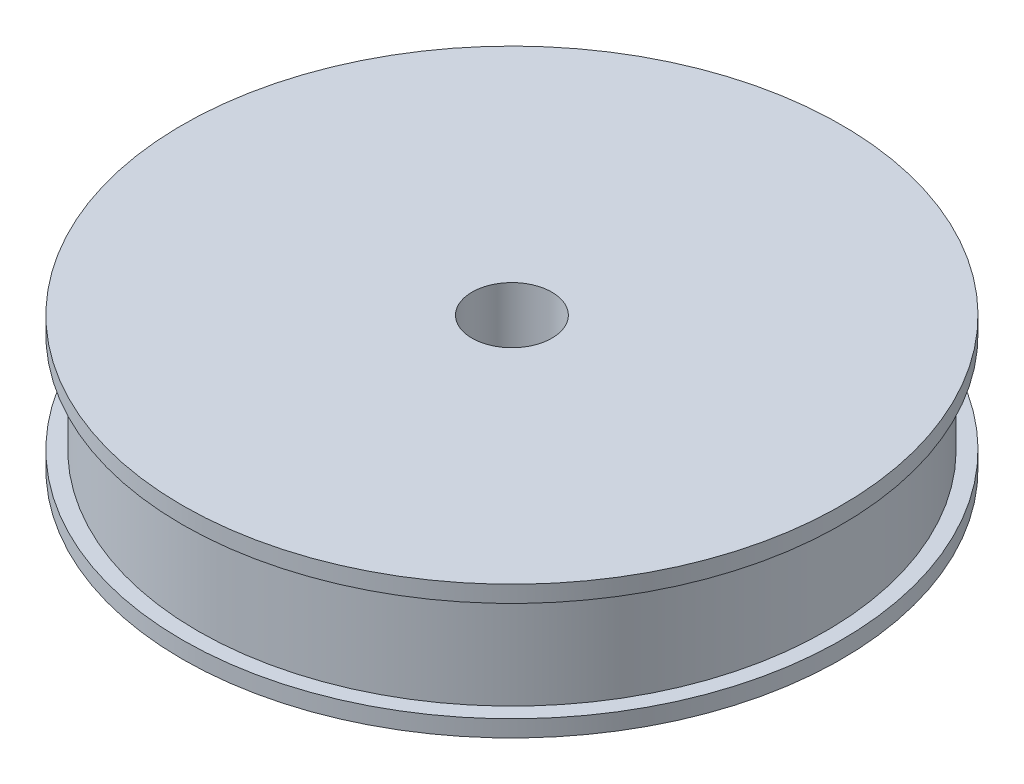
ISO-10303-21;
HEADER;
FILE_DESCRIPTION(('STEP AP214'),'2;1');
FILE_NAME('part.step','',(''),(''),'','','');
FILE_SCHEMA(('AUTOMOTIVE_DESIGN { 1 0 10303 214 1 1 1 1 }'));
ENDSEC;
DATA;
#1=APPLICATION_CONTEXT('core data for automotive mechanical design processes');
#2=APPLICATION_PROTOCOL_DEFINITION('international standard','automotive_design',2000,#1);
#3=PRODUCT_CONTEXT('',#1,'mechanical');
#4=PRODUCT('Part','Part','',(#3));
#5=PRODUCT_RELATED_PRODUCT_CATEGORY('part','',(#4));
#6=PRODUCT_DEFINITION_FORMATION('','',#4);
#7=PRODUCT_DEFINITION_CONTEXT('part definition',#1,'design');
#8=PRODUCT_DEFINITION('design','',#6,#7);
#9=PRODUCT_DEFINITION_SHAPE('','',#8);
#10=(LENGTH_UNIT() NAMED_UNIT(*) SI_UNIT(.MILLI.,.METRE.));
#11=(NAMED_UNIT(*) PLANE_ANGLE_UNIT() SI_UNIT($,.RADIAN.));
#12=(NAMED_UNIT(*) SI_UNIT($,.STERADIAN.) SOLID_ANGLE_UNIT());
#13=UNCERTAINTY_MEASURE_WITH_UNIT(LENGTH_MEASURE(1.E-05),#10,'distance_accuracy_value','');
#14=(GEOMETRIC_REPRESENTATION_CONTEXT(3) GLOBAL_UNCERTAINTY_ASSIGNED_CONTEXT((#13)) GLOBAL_UNIT_ASSIGNED_CONTEXT((#10,
#11,#12)) REPRESENTATION_CONTEXT('',''));
#15=CARTESIAN_POINT('',(0.,0.,0.));
#16=DIRECTION('',(0.,0.,1.));
#17=DIRECTION('',(1.,0.,0.));
#18=AXIS2_PLACEMENT_3D('',#15,#16,#17);
#19=CARTESIAN_POINT('',(0.,12.3387096774194,0.));
#20=DIRECTION('',(0.,1.,0.));
#21=DIRECTION('',(0.,0.,1.));
#22=AXIS2_PLACEMENT_3D('',#19,#20,#21);
#23=CYLINDRICAL_SURFACE('',#22,6.);
#24=CARTESIAN_POINT('',(0.,-7.66129032258065,0.));
#25=DIRECTION('',(0.,1.,0.));
#26=DIRECTION('',(0.,0.,1.));
#27=AXIS2_PLACEMENT_3D('',#24,#25,#26);
#28=CIRCLE('',#27,6.);
#29=CARTESIAN_POINT('',(0.,-7.66129032258065,6.));
#30=VERTEX_POINT('',#29);
#31=EDGE_CURVE('E10',#30,#30,#28,.T.);
#32=ORIENTED_EDGE('',*,*,#31,.F.);
#33=EDGE_LOOP('',(#32));
#34=FACE_BOUND('',#33,.T.);
#35=CARTESIAN_POINT('',(0.,12.3387096774194,0.));
#36=DIRECTION('',(0.,1.,0.));
#37=DIRECTION('',(0.,0.,1.));
#38=AXIS2_PLACEMENT_3D('',#35,#36,#37);
#39=CIRCLE('',#38,6.);
#40=CARTESIAN_POINT('',(0.,12.3387096774194,6.));
#41=VERTEX_POINT('',#40);
#42=EDGE_CURVE('E58',#41,#41,#39,.T.);
#43=ORIENTED_EDGE('',*,*,#42,.T.);
#44=EDGE_LOOP('',(#43));
#45=FACE_BOUND('',#44,.T.);
#46=ADVANCED_FACE('F30',(#34,#45),#23,.F.);
#47=CARTESIAN_POINT('',(6.,-7.66129032258065,0.));
#48=DIRECTION('',(0.,1.,0.));
#49=DIRECTION('',(0.,0.,1.));
#50=AXIS2_PLACEMENT_3D('',#47,#48,#49);
#51=PLANE('',#50);
#52=CARTESIAN_POINT('',(0.,-7.66129032258065,0.));
#53=DIRECTION('',(0.,1.,0.));
#54=DIRECTION('',(0.,0.,1.));
#55=AXIS2_PLACEMENT_3D('',#52,#53,#54);
#56=CIRCLE('',#55,49.5);
#57=CARTESIAN_POINT('',(0.,-7.66129032258065,49.5));
#58=VERTEX_POINT('',#57);
#59=EDGE_CURVE('E36',#58,#58,#56,.T.);
#60=ORIENTED_EDGE('',*,*,#59,.F.);
#61=EDGE_LOOP('',(#60));
#62=FACE_BOUND('',#61,.T.);
#63=ORIENTED_EDGE('',*,*,#31,.T.);
#64=EDGE_LOOP('',(#63));
#65=FACE_BOUND('',#64,.T.);
#66=ADVANCED_FACE('F95',(#62,#65),#51,.F.);
#67=CARTESIAN_POINT('',(0.,12.3387096774194,0.));
#68=DIRECTION('',(0.,1.,0.));
#69=DIRECTION('',(0.,0.,1.));
#70=AXIS2_PLACEMENT_3D('',#67,#68,#69);
#71=CYLINDRICAL_SURFACE('',#70,49.5);
#72=CARTESIAN_POINT('',(0.,-5.16129032258065,0.));
#73=DIRECTION('',(0.,1.,0.));
#74=DIRECTION('',(0.,0.,1.));
#75=AXIS2_PLACEMENT_3D('',#72,#73,#74);
#76=CIRCLE('',#75,49.5);
#77=CARTESIAN_POINT('',(0.,-5.16129032258065,49.5));
#78=VERTEX_POINT('',#77);
#79=EDGE_CURVE('E40',#78,#78,#76,.T.);
#80=ORIENTED_EDGE('',*,*,#79,.F.);
#81=EDGE_LOOP('',(#80));
#82=FACE_BOUND('',#81,.T.);
#83=ORIENTED_EDGE('',*,*,#59,.T.);
#84=EDGE_LOOP('',(#83));
#85=FACE_BOUND('',#84,.T.);
#86=ADVANCED_FACE('F90',(#82,#85),#71,.T.);
#87=CARTESIAN_POINT('',(49.5,-5.16129032258065,0.));
#88=DIRECTION('',(0.,-1.,0.));
#89=DIRECTION('',(0.,0.,-1.));
#90=AXIS2_PLACEMENT_3D('',#87,#88,#89);
#91=PLANE('',#90);
#92=CARTESIAN_POINT('',(0.,-5.16129032258065,0.));
#93=DIRECTION('',(0.,1.,0.));
#94=DIRECTION('',(0.,0.,1.));
#95=AXIS2_PLACEMENT_3D('',#92,#93,#94);
#96=CIRCLE('',#95,47.175);
#97=CARTESIAN_POINT('',(0.,-5.16129032258065,47.175));
#98=VERTEX_POINT('',#97);
#99=EDGE_CURVE('E44',#98,#98,#96,.T.);
#100=ORIENTED_EDGE('',*,*,#99,.F.);
#101=EDGE_LOOP('',(#100));
#102=FACE_BOUND('',#101,.T.);
#103=ORIENTED_EDGE('',*,*,#79,.T.);
#104=EDGE_LOOP('',(#103));
#105=FACE_BOUND('',#104,.T.);
#106=ADVANCED_FACE('F84',(#102,#105),#91,.F.);
#107=CARTESIAN_POINT('',(0.,12.3387096774194,0.));
#108=DIRECTION('',(0.,1.,0.));
#109=DIRECTION('',(0.,0.,1.));
#110=AXIS2_PLACEMENT_3D('',#107,#108,#109);
#111=CYLINDRICAL_SURFACE('',#110,47.175);
#112=CARTESIAN_POINT('',(0.,9.83870967741935,0.));
#113=DIRECTION('',(0.,1.,0.));
#114=DIRECTION('',(0.,0.,1.));
#115=AXIS2_PLACEMENT_3D('',#112,#113,#114);
#116=CIRCLE('',#115,47.175);
#117=CARTESIAN_POINT('',(0.,9.83870967741935,47.175));
#118=VERTEX_POINT('',#117);
#119=EDGE_CURVE('E49',#118,#118,#116,.T.);
#120=ORIENTED_EDGE('',*,*,#119,.F.);
#121=EDGE_LOOP('',(#120));
#122=FACE_BOUND('',#121,.T.);
#123=ORIENTED_EDGE('',*,*,#99,.T.);
#124=EDGE_LOOP('',(#123));
#125=FACE_BOUND('',#124,.T.);
#126=ADVANCED_FACE('F78',(#122,#125),#111,.T.);
#127=CARTESIAN_POINT('',(47.175,9.83870967741935,0.));
#128=DIRECTION('',(0.,1.,0.));
#129=DIRECTION('',(0.,0.,1.));
#130=AXIS2_PLACEMENT_3D('',#127,#128,#129);
#131=PLANE('',#130);
#132=CARTESIAN_POINT('',(0.,9.83870967741935,0.));
#133=DIRECTION('',(0.,1.,0.));
#134=DIRECTION('',(0.,0.,1.));
#135=AXIS2_PLACEMENT_3D('',#132,#133,#134);
#136=CIRCLE('',#135,49.5);
#137=CARTESIAN_POINT('',(0.,9.83870967741935,49.5));
#138=VERTEX_POINT('',#137);
#139=EDGE_CURVE('E52',#138,#138,#136,.T.);
#140=ORIENTED_EDGE('',*,*,#139,.F.);
#141=EDGE_LOOP('',(#140));
#142=FACE_BOUND('',#141,.T.);
#143=ORIENTED_EDGE('',*,*,#119,.T.);
#144=EDGE_LOOP('',(#143));
#145=FACE_BOUND('',#144,.T.);
#146=ADVANCED_FACE('F72',(#142,#145),#131,.F.);
#147=CARTESIAN_POINT('',(0.,12.3387096774194,0.));
#148=DIRECTION('',(0.,1.,0.));
#149=DIRECTION('',(0.,0.,1.));
#150=AXIS2_PLACEMENT_3D('',#147,#148,#149);
#151=CYLINDRICAL_SURFACE('',#150,49.5);
#152=CARTESIAN_POINT('',(0.,12.3387096774194,0.));
#153=DIRECTION('',(0.,1.,0.));
#154=DIRECTION('',(0.,0.,1.));
#155=AXIS2_PLACEMENT_3D('',#152,#153,#154);
#156=CIRCLE('',#155,49.5);
#157=CARTESIAN_POINT('',(0.,12.3387096774194,49.5));
#158=VERTEX_POINT('',#157);
#159=EDGE_CURVE('E55',#158,#158,#156,.T.);
#160=ORIENTED_EDGE('',*,*,#159,.F.);
#161=EDGE_LOOP('',(#160));
#162=FACE_BOUND('',#161,.T.);
#163=ORIENTED_EDGE('',*,*,#139,.T.);
#164=EDGE_LOOP('',(#163));
#165=FACE_BOUND('',#164,.T.);
#166=ADVANCED_FACE('F66',(#162,#165),#151,.T.);
#167=CARTESIAN_POINT('',(49.5,12.3387096774194,0.));
#168=DIRECTION('',(0.,-1.,0.));
#169=DIRECTION('',(0.,0.,-1.));
#170=AXIS2_PLACEMENT_3D('',#167,#168,#169);
#171=PLANE('',#170);
#172=ORIENTED_EDGE('',*,*,#42,.F.);
#173=EDGE_LOOP('',(#172));
#174=FACE_BOUND('',#173,.T.);
#175=ORIENTED_EDGE('',*,*,#159,.T.);
#176=EDGE_LOOP('',(#175));
#177=FACE_BOUND('',#176,.T.);
#178=ADVANCED_FACE('F63',(#174,#177),#171,.F.);
#179=CLOSED_SHELL('',(#46,#66,#86,#106,#126,#146,#166,#178));
#180=MANIFOLD_SOLID_BREP('B2',#179);
#181=ADVANCED_BREP_SHAPE_REPRESENTATION('',(#18,#180),#14);
#182=SHAPE_DEFINITION_REPRESENTATION(#9,#181);
ENDSEC;
END-ISO-10303-21;
